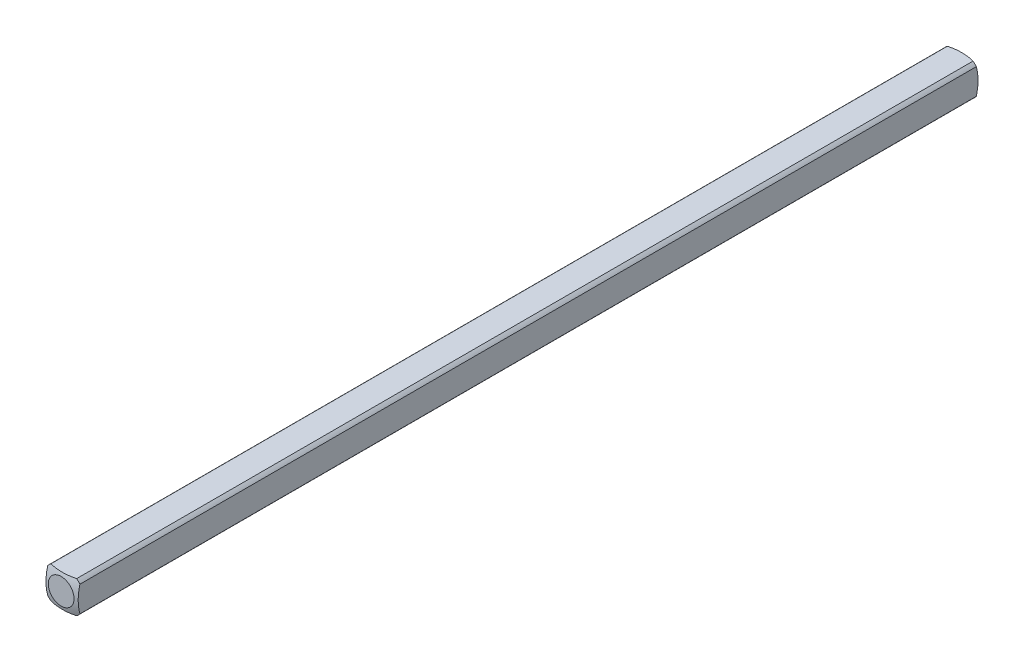
ISO-10303-21;
HEADER;
FILE_DESCRIPTION(('STEP AP214'),'2;1');
FILE_NAME('part.step','',(''),(''),'','','');
FILE_SCHEMA(('AUTOMOTIVE_DESIGN { 1 0 10303 214 1 1 1 1 }'));
ENDSEC;
DATA;
#1=APPLICATION_CONTEXT('core data for automotive mechanical design processes');
#2=APPLICATION_PROTOCOL_DEFINITION('international standard','automotive_design',2000,#1);
#3=PRODUCT_CONTEXT('',#1,'mechanical');
#4=PRODUCT('Part','Part','',(#3));
#5=PRODUCT_RELATED_PRODUCT_CATEGORY('part','',(#4));
#6=PRODUCT_DEFINITION_FORMATION('','',#4);
#7=PRODUCT_DEFINITION_CONTEXT('part definition',#1,'design');
#8=PRODUCT_DEFINITION('design','',#6,#7);
#9=PRODUCT_DEFINITION_SHAPE('','',#8);
#10=(LENGTH_UNIT() NAMED_UNIT(*) SI_UNIT(.MILLI.,.METRE.));
#11=(NAMED_UNIT(*) PLANE_ANGLE_UNIT() SI_UNIT($,.RADIAN.));
#12=(NAMED_UNIT(*) SI_UNIT($,.STERADIAN.) SOLID_ANGLE_UNIT());
#13=UNCERTAINTY_MEASURE_WITH_UNIT(LENGTH_MEASURE(1.E-05),#10,'distance_accuracy_value','');
#14=(GEOMETRIC_REPRESENTATION_CONTEXT(3) GLOBAL_UNCERTAINTY_ASSIGNED_CONTEXT((#13)) GLOBAL_UNIT_ASSIGNED_CONTEXT((#10,
#11,#12)) REPRESENTATION_CONTEXT('',''));
#15=CARTESIAN_POINT('',(0.,0.,0.));
#16=DIRECTION('',(0.,0.,1.));
#17=DIRECTION('',(1.,0.,0.));
#18=AXIS2_PLACEMENT_3D('',#15,#16,#17);
#19=CARTESIAN_POINT('',(-1.5875,-1.5875,44.45));
#20=DIRECTION('',(1.,0.,0.));
#21=DIRECTION('',(0.,0.,-1.));
#22=AXIS2_PLACEMENT_3D('',#19,#20,#21);
#23=PLANE('',#22);
#24=CARTESIAN_POINT('',(-1.5875,0.,4.91912226376204));
#25=DIRECTION('',(1.,0.,0.));
#26=DIRECTION('',(0.,0.,-1.));
#27=AXIS2_PLACEMENT_3D('',#24,#25,#26);
#28=CIRCLE('',#27,4.82558221875869);
#29=CARTESIAN_POINT('',(-1.5875,-1.26841150657032,0.263225357686904));
#30=VERTEX_POINT('',#29);
#31=CARTESIAN_POINT('',(-1.5875,1.26841150657032,0.263225357686907));
#32=VERTEX_POINT('',#31);
#33=EDGE_CURVE('E50',#30,#32,#28,.T.);
#34=ORIENTED_EDGE('',*,*,#33,.F.);
#35=DIRECTION('',(0.,0.,-1.));
#36=VECTOR('',#35,1.);
#37=CARTESIAN_POINT('',(-1.5875,-1.26841150657032,44.45));
#38=LINE('',#37,#36);
#39=CARTESIAN_POINT('',(-1.5875,-1.26841150657032,88.6367746423131));
#40=VERTEX_POINT('',#39);
#41=EDGE_CURVE('E43',#40,#30,#38,.T.);
#42=ORIENTED_EDGE('',*,*,#41,.F.);
#43=CARTESIAN_POINT('',(-1.5875,0.,83.980877736238));
#44=DIRECTION('',(-1.,0.,0.));
#45=DIRECTION('',(0.,0.,1.));
#46=AXIS2_PLACEMENT_3D('',#43,#44,#45);
#47=CIRCLE('',#46,4.82558221875869);
#48=CARTESIAN_POINT('',(-1.5875,1.26841150657032,88.6367746423131));
#49=VERTEX_POINT('',#48);
#50=EDGE_CURVE('E126',#40,#49,#47,.T.);
#51=ORIENTED_EDGE('',*,*,#50,.T.);
#52=DIRECTION('',(0.,0.,-1.));
#53=VECTOR('',#52,1.);
#54=CARTESIAN_POINT('',(-1.5875,1.26841150657032,44.45));
#55=LINE('',#54,#53);
#56=EDGE_CURVE('E114',#32,#49,#55,.F.);
#57=ORIENTED_EDGE('',*,*,#56,.F.);
#58=EDGE_LOOP('',(#34,#42,#51,#57));
#59=FACE_BOUND('',#58,.T.);
#60=ADVANCED_FACE('F36',(#59),#23,.F.);
#61=CARTESIAN_POINT('',(-1.5875,-1.5875,44.45));
#62=DIRECTION('',(0.,1.,0.));
#63=DIRECTION('',(0.,0.,1.));
#64=AXIS2_PLACEMENT_3D('',#61,#62,#63);
#65=PLANE('',#64);
#66=CARTESIAN_POINT('',(0.,-1.5875,4.91912226376204));
#67=DIRECTION('',(0.,1.,0.));
#68=DIRECTION('',(0.,0.,1.));
#69=AXIS2_PLACEMENT_3D('',#66,#67,#68);
#70=CIRCLE('',#69,4.82558221875869);
#71=CARTESIAN_POINT('',(1.26841150657032,-1.5875,0.263225357686905));
#72=VERTEX_POINT('',#71);
#73=CARTESIAN_POINT('',(-1.26841150657032,-1.5875,0.263225357686904));
#74=VERTEX_POINT('',#73);
#75=EDGE_CURVE('E155',#72,#74,#70,.T.);
#76=ORIENTED_EDGE('',*,*,#75,.F.);
#77=DIRECTION('',(0.,0.,-1.));
#78=VECTOR('',#77,1.);
#79=CARTESIAN_POINT('',(1.26841150657032,-1.5875,44.45));
#80=LINE('',#79,#78);
#81=CARTESIAN_POINT('',(1.26841150657032,-1.5875,88.6367746423131));
#82=VERTEX_POINT('',#81);
#83=EDGE_CURVE('E168',#82,#72,#80,.T.);
#84=ORIENTED_EDGE('',*,*,#83,.F.);
#85=CARTESIAN_POINT('',(0.,-1.5875,83.980877736238));
#86=DIRECTION('',(0.,-1.,0.));
#87=DIRECTION('',(0.,0.,-1.));
#88=AXIS2_PLACEMENT_3D('',#85,#86,#87);
#89=CIRCLE('',#88,4.82558221875869);
#90=CARTESIAN_POINT('',(-1.26841150657032,-1.5875,88.6367746423131));
#91=VERTEX_POINT('',#90);
#92=EDGE_CURVE('E137',#82,#91,#89,.T.);
#93=ORIENTED_EDGE('',*,*,#92,.T.);
#94=DIRECTION('',(0.,0.,-1.));
#95=VECTOR('',#94,1.);
#96=CARTESIAN_POINT('',(-1.26841150657032,-1.5875,44.45));
#97=LINE('',#96,#95);
#98=EDGE_CURVE('E166',#74,#91,#97,.F.);
#99=ORIENTED_EDGE('',*,*,#98,.F.);
#100=EDGE_LOOP('',(#76,#84,#93,#99));
#101=FACE_BOUND('',#100,.T.);
#102=ADVANCED_FACE('F178',(#101),#65,.F.);
#103=CARTESIAN_POINT('',(1.5875,-1.5875,44.45));
#104=DIRECTION('',(-1.,0.,0.));
#105=DIRECTION('',(0.,0.,1.));
#106=AXIS2_PLACEMENT_3D('',#103,#104,#105);
#107=PLANE('',#106);
#108=CARTESIAN_POINT('',(1.5875,0.,4.91912226376204));
#109=DIRECTION('',(-1.,0.,0.));
#110=DIRECTION('',(0.,0.,1.));
#111=AXIS2_PLACEMENT_3D('',#108,#109,#110);
#112=CIRCLE('',#111,4.82558221875869);
#113=CARTESIAN_POINT('',(1.5875,1.26841150657032,0.263225357686904));
#114=VERTEX_POINT('',#113);
#115=CARTESIAN_POINT('',(1.5875,-1.26841150657032,0.263225357686904));
#116=VERTEX_POINT('',#115);
#117=EDGE_CURVE('E153',#114,#116,#112,.T.);
#118=ORIENTED_EDGE('',*,*,#117,.F.);
#119=DIRECTION('',(0.,0.,-1.));
#120=VECTOR('',#119,1.);
#121=CARTESIAN_POINT('',(1.5875,1.26841150657032,44.45));
#122=LINE('',#121,#120);
#123=CARTESIAN_POINT('',(1.5875,1.26841150657032,88.6367746423131));
#124=VERTEX_POINT('',#123);
#125=EDGE_CURVE('E163',#124,#114,#122,.T.);
#126=ORIENTED_EDGE('',*,*,#125,.F.);
#127=CARTESIAN_POINT('',(1.5875,0.,83.980877736238));
#128=DIRECTION('',(1.,0.,0.));
#129=DIRECTION('',(0.,0.,-1.));
#130=AXIS2_PLACEMENT_3D('',#127,#128,#129);
#131=CIRCLE('',#130,4.82558221875869);
#132=CARTESIAN_POINT('',(1.5875,-1.26841150657032,88.6367746423131));
#133=VERTEX_POINT('',#132);
#134=EDGE_CURVE('E134',#124,#133,#131,.T.);
#135=ORIENTED_EDGE('',*,*,#134,.T.);
#136=DIRECTION('',(0.,0.,-1.));
#137=VECTOR('',#136,1.);
#138=CARTESIAN_POINT('',(1.5875,-1.26841150657032,44.45));
#139=LINE('',#138,#137);
#140=EDGE_CURVE('E107',#116,#133,#139,.F.);
#141=ORIENTED_EDGE('',*,*,#140,.F.);
#142=EDGE_LOOP('',(#118,#126,#135,#141));
#143=FACE_BOUND('',#142,.T.);
#144=ADVANCED_FACE('F185',(#143),#107,.F.);
#145=CARTESIAN_POINT('',(-1.5875,1.5875,44.45));
#146=DIRECTION('',(0.,-1.,0.));
#147=DIRECTION('',(0.,0.,-1.));
#148=AXIS2_PLACEMENT_3D('',#145,#146,#147);
#149=PLANE('',#148);
#150=CARTESIAN_POINT('',(0.,1.5875,4.91912226376204));
#151=DIRECTION('',(0.,-1.,0.));
#152=DIRECTION('',(0.,0.,-1.));
#153=AXIS2_PLACEMENT_3D('',#150,#151,#152);
#154=CIRCLE('',#153,4.82558221875869);
#155=CARTESIAN_POINT('',(-1.26841150657032,1.5875,0.263225357686904));
#156=VERTEX_POINT('',#155);
#157=CARTESIAN_POINT('',(1.26841150657032,1.5875,0.263225357686904));
#158=VERTEX_POINT('',#157);
#159=EDGE_CURVE('E105',#156,#158,#154,.T.);
#160=ORIENTED_EDGE('',*,*,#159,.F.);
#161=DIRECTION('',(0.,0.,-1.));
#162=VECTOR('',#161,1.);
#163=CARTESIAN_POINT('',(-1.26841150657032,1.5875,44.45));
#164=LINE('',#163,#162);
#165=CARTESIAN_POINT('',(-1.26841150657032,1.5875,88.6367746423131));
#166=VERTEX_POINT('',#165);
#167=EDGE_CURVE('E99',#166,#156,#164,.T.);
#168=ORIENTED_EDGE('',*,*,#167,.F.);
#169=CARTESIAN_POINT('',(0.,1.5875,83.980877736238));
#170=DIRECTION('',(0.,1.,0.));
#171=DIRECTION('',(0.,0.,1.));
#172=AXIS2_PLACEMENT_3D('',#169,#170,#171);
#173=CIRCLE('',#172,4.82558221875869);
#174=CARTESIAN_POINT('',(1.26841150657032,1.5875,88.6367746423131));
#175=VERTEX_POINT('',#174);
#176=EDGE_CURVE('E104',#166,#175,#173,.T.);
#177=ORIENTED_EDGE('',*,*,#176,.T.);
#178=DIRECTION('',(0.,0.,-1.));
#179=VECTOR('',#178,1.);
#180=CARTESIAN_POINT('',(1.26841150657032,1.5875,44.45));
#181=LINE('',#180,#179);
#182=EDGE_CURVE('E108',#158,#175,#181,.F.);
#183=ORIENTED_EDGE('',*,*,#182,.F.);
#184=EDGE_LOOP('',(#160,#168,#177,#183));
#185=FACE_BOUND('',#184,.T.);
#186=ADVANCED_FACE('F101',(#185),#149,.F.);
#187=CARTESIAN_POINT('',(0.,0.,44.45));
#188=DIRECTION('',(0.,0.,-1.));
#189=DIRECTION('',(-1.,0.,0.));
#190=AXIS2_PLACEMENT_3D('',#187,#188,#189);
#191=CYLINDRICAL_SURFACE('',#190,2.032);
#192=ORIENTED_EDGE('',*,*,#41,.T.);
#193=CARTESIAN_POINT('',(0.,0.,0.263225357686904));
#194=DIRECTION('',(0.,0.,1.));
#195=DIRECTION('',(1.,0.,0.));
#196=AXIS2_PLACEMENT_3D('',#193,#194,#195);
#197=CIRCLE('',#196,2.032);
#198=EDGE_CURVE('E150',#30,#74,#197,.T.);
#199=ORIENTED_EDGE('',*,*,#198,.T.);
#200=ORIENTED_EDGE('',*,*,#98,.T.);
#201=CARTESIAN_POINT('',(0.,0.,88.6367746423131));
#202=DIRECTION('',(0.,0.,1.));
#203=DIRECTION('',(1.,0.,0.));
#204=AXIS2_PLACEMENT_3D('',#201,#202,#203);
#205=CIRCLE('',#204,2.032);
#206=EDGE_CURVE('E131',#40,#91,#205,.T.);
#207=ORIENTED_EDGE('',*,*,#206,.F.);
#208=EDGE_LOOP('',(#192,#199,#200,#207));
#209=FACE_BOUND('',#208,.T.);
#210=ADVANCED_FACE('F174',(#209),#191,.T.);
#211=ORIENTED_EDGE('',*,*,#83,.T.);
#212=CARTESIAN_POINT('',(0.,0.,0.263225357686904));
#213=DIRECTION('',(0.,0.,1.));
#214=DIRECTION('',(1.,0.,0.));
#215=AXIS2_PLACEMENT_3D('',#212,#213,#214);
#216=CIRCLE('',#215,2.032);
#217=EDGE_CURVE('E56',#72,#116,#216,.T.);
#218=ORIENTED_EDGE('',*,*,#217,.T.);
#219=ORIENTED_EDGE('',*,*,#140,.T.);
#220=CARTESIAN_POINT('',(0.,0.,88.6367746423131));
#221=DIRECTION('',(0.,0.,1.));
#222=DIRECTION('',(1.,0.,0.));
#223=AXIS2_PLACEMENT_3D('',#220,#221,#222);
#224=CIRCLE('',#223,2.032);
#225=EDGE_CURVE('E140',#82,#133,#224,.T.);
#226=ORIENTED_EDGE('',*,*,#225,.F.);
#227=EDGE_LOOP('',(#211,#218,#219,#226));
#228=FACE_BOUND('',#227,.T.);
#229=ADVANCED_FACE('F181',(#228),#191,.T.);
#230=ORIENTED_EDGE('',*,*,#125,.T.);
#231=CARTESIAN_POINT('',(0.,0.,0.263225357686904));
#232=DIRECTION('',(0.,0.,1.));
#233=DIRECTION('',(1.,0.,0.));
#234=AXIS2_PLACEMENT_3D('',#231,#232,#233);
#235=CIRCLE('',#234,2.032);
#236=EDGE_CURVE('E147',#114,#158,#235,.T.);
#237=ORIENTED_EDGE('',*,*,#236,.T.);
#238=ORIENTED_EDGE('',*,*,#182,.T.);
#239=CARTESIAN_POINT('',(0.,0.,88.6367746423131));
#240=DIRECTION('',(0.,0.,1.));
#241=DIRECTION('',(1.,0.,0.));
#242=AXIS2_PLACEMENT_3D('',#239,#240,#241);
#243=CIRCLE('',#242,2.032);
#244=EDGE_CURVE('E125',#124,#175,#243,.T.);
#245=ORIENTED_EDGE('',*,*,#244,.F.);
#246=EDGE_LOOP('',(#230,#237,#238,#245));
#247=FACE_BOUND('',#246,.T.);
#248=ADVANCED_FACE('F187',(#247),#191,.T.);
#249=ORIENTED_EDGE('',*,*,#167,.T.);
#250=CARTESIAN_POINT('',(0.,0.,0.263225357686904));
#251=DIRECTION('',(0.,0.,1.));
#252=DIRECTION('',(1.,0.,0.));
#253=AXIS2_PLACEMENT_3D('',#250,#251,#252);
#254=CIRCLE('',#253,2.032);
#255=EDGE_CURVE('E12',#156,#32,#254,.T.);
#256=ORIENTED_EDGE('',*,*,#255,.T.);
#257=ORIENTED_EDGE('',*,*,#56,.T.);
#258=CARTESIAN_POINT('',(0.,0.,88.6367746423131));
#259=DIRECTION('',(0.,0.,1.));
#260=DIRECTION('',(1.,0.,0.));
#261=AXIS2_PLACEMENT_3D('',#258,#259,#260);
#262=CIRCLE('',#261,2.032);
#263=EDGE_CURVE('E111',#166,#49,#262,.T.);
#264=ORIENTED_EDGE('',*,*,#263,.F.);
#265=EDGE_LOOP('',(#249,#256,#257,#264));
#266=FACE_BOUND('',#265,.T.);
#267=ADVANCED_FACE('F112',(#266),#191,.T.);
#268=CARTESIAN_POINT('',(0.,0.,4.91912226376204));
#269=DIRECTION('',(0.,0.,1.));
#270=DIRECTION('',(-1.,0.,0.));
#271=AXIS2_PLACEMENT_3D('',#268,#269,#270);
#272=SPHERICAL_SURFACE('',#271,5.08);
#273=CARTESIAN_POINT('',(0.,0.,0.));
#274=DIRECTION('',(0.,0.,-1.));
#275=DIRECTION('',(-1.,0.,0.));
#276=AXIS2_PLACEMENT_3D('',#273,#274,#275);
#277=CIRCLE('',#276,1.26832020963187);
#278=CARTESIAN_POINT('',(-1.26832020963187,0.,0.));
#279=VERTEX_POINT('',#278);
#280=EDGE_CURVE('E158',#279,#279,#277,.T.);
#281=ORIENTED_EDGE('',*,*,#280,.F.);
#282=EDGE_LOOP('',(#281));
#283=FACE_BOUND('',#282,.T.);
#284=ORIENTED_EDGE('',*,*,#75,.T.);
#285=ORIENTED_EDGE('',*,*,#198,.F.);
#286=ORIENTED_EDGE('',*,*,#33,.T.);
#287=ORIENTED_EDGE('',*,*,#255,.F.);
#288=ORIENTED_EDGE('',*,*,#159,.T.);
#289=ORIENTED_EDGE('',*,*,#236,.F.);
#290=ORIENTED_EDGE('',*,*,#117,.T.);
#291=ORIENTED_EDGE('',*,*,#217,.F.);
#292=EDGE_LOOP('',(#284,#285,#286,#287,#288,#289,#290,#291));
#293=FACE_BOUND('',#292,.T.);
#294=ADVANCED_FACE('F188',(#283,#293),#272,.T.);
#295=CARTESIAN_POINT('',(0.,0.,0.));
#296=DIRECTION('',(0.,0.,-1.));
#297=DIRECTION('',(-1.,0.,0.));
#298=AXIS2_PLACEMENT_3D('',#295,#296,#297);
#299=PLANE('',#298);
#300=ORIENTED_EDGE('',*,*,#280,.T.);
#301=EDGE_LOOP('',(#300));
#302=FACE_BOUND('',#301,.T.);
#303=ADVANCED_FACE('F190',(#302),#299,.T.);
#304=CARTESIAN_POINT('',(0.,0.,83.980877736238));
#305=DIRECTION('',(0.,0.,-1.));
#306=DIRECTION('',(-1.,0.,0.));
#307=AXIS2_PLACEMENT_3D('',#304,#305,#306);
#308=SPHERICAL_SURFACE('',#307,5.08);
#309=CARTESIAN_POINT('',(0.,0.,88.9));
#310=DIRECTION('',(0.,0.,-1.));
#311=DIRECTION('',(-1.,0.,0.));
#312=AXIS2_PLACEMENT_3D('',#309,#310,#311);
#313=CIRCLE('',#312,1.26832020963187);
#314=CARTESIAN_POINT('',(-1.26832020963187,0.,88.9));
#315=VERTEX_POINT('',#314);
#316=EDGE_CURVE('E118',#315,#315,#313,.T.);
#317=ORIENTED_EDGE('',*,*,#316,.T.);
#318=EDGE_LOOP('',(#317));
#319=FACE_BOUND('',#318,.T.);
#320=ORIENTED_EDGE('',*,*,#92,.F.);
#321=ORIENTED_EDGE('',*,*,#225,.T.);
#322=ORIENTED_EDGE('',*,*,#134,.F.);
#323=ORIENTED_EDGE('',*,*,#244,.T.);
#324=ORIENTED_EDGE('',*,*,#176,.F.);
#325=ORIENTED_EDGE('',*,*,#263,.T.);
#326=ORIENTED_EDGE('',*,*,#50,.F.);
#327=ORIENTED_EDGE('',*,*,#206,.T.);
#328=EDGE_LOOP('',(#320,#321,#322,#323,#324,#325,#326,#327));
#329=FACE_BOUND('',#328,.T.);
#330=ADVANCED_FACE('F122',(#319,#329),#308,.T.);
#331=CARTESIAN_POINT('',(0.,0.,88.9));
#332=DIRECTION('',(0.,0.,1.));
#333=DIRECTION('',(-1.,0.,0.));
#334=AXIS2_PLACEMENT_3D('',#331,#332,#333);
#335=PLANE('',#334);
#336=ORIENTED_EDGE('',*,*,#316,.F.);
#337=EDGE_LOOP('',(#336));
#338=FACE_BOUND('',#337,.T.);
#339=ADVANCED_FACE('F235',(#338),#335,.T.);
#340=CLOSED_SHELL('',(#60,#102,#144,#186,#210,#229,#248,#267,#294,#303,#330,#339));
#341=MANIFOLD_SOLID_BREP('B2',#340);
#342=ADVANCED_BREP_SHAPE_REPRESENTATION('',(#18,#341),#14);
#343=SHAPE_DEFINITION_REPRESENTATION(#9,#342);
ENDSEC;
END-ISO-10303-21;
